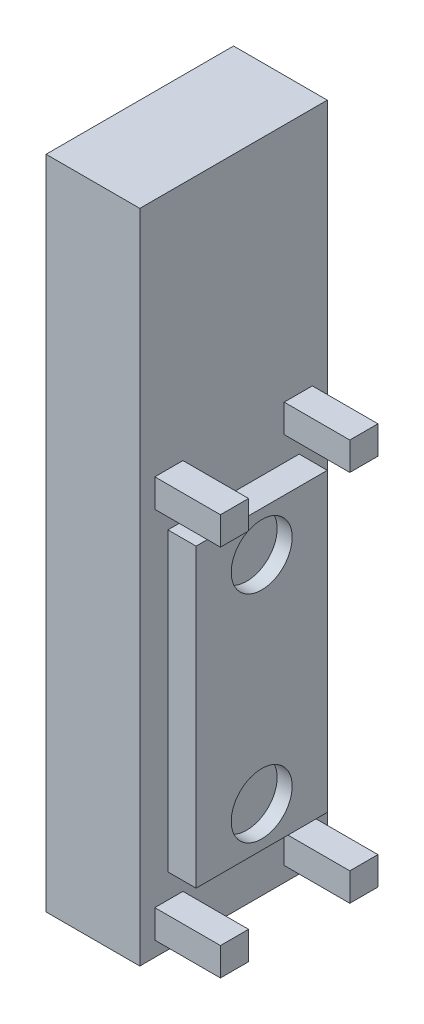
ISO-10303-21;
HEADER;
FILE_DESCRIPTION(('STEP AP214'),'2;1');
FILE_NAME('part.step','',(''),(''),'','','');
FILE_SCHEMA(('AUTOMOTIVE_DESIGN { 1 0 10303 214 1 1 1 1 }'));
ENDSEC;
DATA;
#1=APPLICATION_CONTEXT('core data for automotive mechanical design processes');
#2=APPLICATION_PROTOCOL_DEFINITION('international standard','automotive_design',2000,#1);
#3=PRODUCT_CONTEXT('',#1,'mechanical');
#4=PRODUCT('Part','Part','',(#3));
#5=PRODUCT_RELATED_PRODUCT_CATEGORY('part','',(#4));
#6=PRODUCT_DEFINITION_FORMATION('','',#4);
#7=PRODUCT_DEFINITION_CONTEXT('part definition',#1,'design');
#8=PRODUCT_DEFINITION('design','',#6,#7);
#9=PRODUCT_DEFINITION_SHAPE('','',#8);
#10=(LENGTH_UNIT() NAMED_UNIT(*) SI_UNIT(.MILLI.,.METRE.));
#11=(NAMED_UNIT(*) PLANE_ANGLE_UNIT() SI_UNIT($,.RADIAN.));
#12=(NAMED_UNIT(*) SI_UNIT($,.STERADIAN.) SOLID_ANGLE_UNIT());
#13=UNCERTAINTY_MEASURE_WITH_UNIT(LENGTH_MEASURE(1.E-05),#10,'distance_accuracy_value','');
#14=(GEOMETRIC_REPRESENTATION_CONTEXT(3) GLOBAL_UNCERTAINTY_ASSIGNED_CONTEXT((#13)) GLOBAL_UNIT_ASSIGNED_CONTEXT((#10,
#11,#12)) REPRESENTATION_CONTEXT('',''));
#15=CARTESIAN_POINT('',(0.,0.,0.));
#16=DIRECTION('',(0.,0.,1.));
#17=DIRECTION('',(1.,0.,0.));
#18=AXIS2_PLACEMENT_3D('',#15,#16,#17);
#19=CARTESIAN_POINT('',(10.,0.,0.));
#20=DIRECTION('',(-1.,0.,0.));
#21=DIRECTION('',(0.,0.,1.));
#22=AXIS2_PLACEMENT_3D('',#19,#20,#21);
#23=PLANE('',#22);
#24=DIRECTION('',(0.,-1.,0.));
#25=VECTOR('',#24,1.);
#26=CARTESIAN_POINT('',(10.,-30.4,8.4));
#27=LINE('',#26,#25);
#28=CARTESIAN_POINT('',(10.,-30.4,8.4));
#29=VERTEX_POINT('',#28);
#30=CARTESIAN_POINT('',(10.,-33.4,8.4));
#31=VERTEX_POINT('',#30);
#32=EDGE_CURVE('E293',#29,#31,#27,.T.);
#33=ORIENTED_EDGE('',*,*,#32,.F.);
#34=DIRECTION('',(0.,0.,1.));
#35=VECTOR('',#34,1.);
#36=CARTESIAN_POINT('',(10.,-30.4,8.4));
#37=LINE('',#36,#35);
#38=CARTESIAN_POINT('',(10.,-30.4,5.4));
#39=VERTEX_POINT('',#38);
#40=EDGE_CURVE('E345',#39,#29,#37,.T.);
#41=ORIENTED_EDGE('',*,*,#40,.F.);
#42=DIRECTION('',(0.,1.,0.));
#43=VECTOR('',#42,1.);
#44=CARTESIAN_POINT('',(10.,-30.4,5.4));
#45=LINE('',#44,#43);
#46=CARTESIAN_POINT('',(10.,-33.4,5.4));
#47=VERTEX_POINT('',#46);
#48=EDGE_CURVE('E349',#47,#39,#45,.T.);
#49=ORIENTED_EDGE('',*,*,#48,.F.);
#50=DIRECTION('',(0.,0.,-1.));
#51=VECTOR('',#50,1.);
#52=CARTESIAN_POINT('',(10.,-33.4,8.4));
#53=LINE('',#52,#51);
#54=EDGE_CURVE('E354',#31,#47,#53,.T.);
#55=ORIENTED_EDGE('',*,*,#54,.F.);
#56=EDGE_LOOP('',(#33,#41,#49,#55));
#57=FACE_BOUND('',#56,.T.);
#58=DIRECTION('',(0.,1.,0.));
#59=VECTOR('',#58,1.);
#60=CARTESIAN_POINT('',(10.,6.40000000000001,-8.40000000000001));
#61=LINE('',#60,#59);
#62=CARTESIAN_POINT('',(10.,6.40000000000001,-8.40000000000001));
#63=VERTEX_POINT('',#62);
#64=CARTESIAN_POINT('',(10.,9.40000000000001,-8.40000000000001));
#65=VERTEX_POINT('',#64);
#66=EDGE_CURVE('E272',#63,#65,#61,.T.);
#67=ORIENTED_EDGE('',*,*,#66,.F.);
#68=DIRECTION('',(0.,0.,-1.));
#69=VECTOR('',#68,1.);
#70=CARTESIAN_POINT('',(10.,6.40000000000001,-8.40000000000001));
#71=LINE('',#70,#69);
#72=CARTESIAN_POINT('',(10.,6.40000000000001,-5.40000000000001));
#73=VERTEX_POINT('',#72);
#74=EDGE_CURVE('E259',#73,#63,#71,.T.);
#75=ORIENTED_EDGE('',*,*,#74,.F.);
#76=DIRECTION('',(0.,-1.,0.));
#77=VECTOR('',#76,1.);
#78=CARTESIAN_POINT('',(10.,6.40000000000001,-5.40000000000001));
#79=LINE('',#78,#77);
#80=CARTESIAN_POINT('',(10.,9.40000000000001,-5.40000000000001));
#81=VERTEX_POINT('',#80);
#82=EDGE_CURVE('E263',#81,#73,#79,.T.);
#83=ORIENTED_EDGE('',*,*,#82,.F.);
#84=DIRECTION('',(0.,0.,1.));
#85=VECTOR('',#84,1.);
#86=CARTESIAN_POINT('',(10.,9.40000000000001,-8.40000000000001));
#87=LINE('',#86,#85);
#88=EDGE_CURVE('E268',#65,#81,#87,.T.);
#89=ORIENTED_EDGE('',*,*,#88,.F.);
#90=EDGE_LOOP('',(#67,#75,#83,#89));
#91=FACE_BOUND('',#90,.T.);
#92=DIRECTION('',(0.,1.,0.));
#93=VECTOR('',#92,1.);
#94=CARTESIAN_POINT('',(10.,-35.,-10.));
#95=LINE('',#94,#93);
#96=CARTESIAN_POINT('',(10.,-35.,-10.));
#97=VERTEX_POINT('',#96);
#98=CARTESIAN_POINT('',(10.,35.,-10.));
#99=VERTEX_POINT('',#98);
#100=EDGE_CURVE('E417',#97,#99,#95,.T.);
#101=ORIENTED_EDGE('',*,*,#100,.T.);
#102=DIRECTION('',(0.,0.,1.));
#103=VECTOR('',#102,1.);
#104=CARTESIAN_POINT('',(10.,35.,10.));
#105=LINE('',#104,#103);
#106=CARTESIAN_POINT('',(10.,35.,10.));
#107=VERTEX_POINT('',#106);
#108=EDGE_CURVE('E421',#99,#107,#105,.T.);
#109=ORIENTED_EDGE('',*,*,#108,.T.);
#110=DIRECTION('',(0.,-1.,0.));
#111=VECTOR('',#110,1.);
#112=CARTESIAN_POINT('',(10.,-35.,10.));
#113=LINE('',#112,#111);
#114=CARTESIAN_POINT('',(10.,-35.,10.));
#115=VERTEX_POINT('',#114);
#116=EDGE_CURVE('E425',#107,#115,#113,.T.);
#117=ORIENTED_EDGE('',*,*,#116,.T.);
#118=DIRECTION('',(0.,0.,-1.));
#119=VECTOR('',#118,1.);
#120=CARTESIAN_POINT('',(10.,-35.,10.));
#121=LINE('',#120,#119);
#122=EDGE_CURVE('E428',#115,#97,#121,.T.);
#123=ORIENTED_EDGE('',*,*,#122,.T.);
#124=EDGE_LOOP('',(#101,#109,#117,#123));
#125=FACE_BOUND('',#124,.T.);
#126=DIRECTION('',(0.,1.,0.));
#127=VECTOR('',#126,1.);
#128=CARTESIAN_POINT('',(10.,6.40000000000001,5.4));
#129=LINE('',#128,#127);
#130=CARTESIAN_POINT('',(10.,6.40000000000001,5.4));
#131=VERTEX_POINT('',#130);
#132=CARTESIAN_POINT('',(10.,9.40000000000001,5.4));
#133=VERTEX_POINT('',#132);
#134=EDGE_CURVE('E276',#131,#133,#129,.T.);
#135=ORIENTED_EDGE('',*,*,#134,.F.);
#136=DIRECTION('',(0.,0.,-1.));
#137=VECTOR('',#136,1.);
#138=CARTESIAN_POINT('',(10.,6.40000000000001,8.4));
#139=LINE('',#138,#137);
#140=CARTESIAN_POINT('',(10.,6.40000000000001,8.4));
#141=VERTEX_POINT('',#140);
#142=EDGE_CURVE('E377',#141,#131,#139,.T.);
#143=ORIENTED_EDGE('',*,*,#142,.F.);
#144=DIRECTION('',(0.,-1.,0.));
#145=VECTOR('',#144,1.);
#146=CARTESIAN_POINT('',(10.,6.40000000000001,8.4));
#147=LINE('',#146,#145);
#148=CARTESIAN_POINT('',(10.,9.40000000000001,8.4));
#149=VERTEX_POINT('',#148);
#150=EDGE_CURVE('E394',#149,#141,#147,.T.);
#151=ORIENTED_EDGE('',*,*,#150,.F.);
#152=DIRECTION('',(0.,0.,1.));
#153=VECTOR('',#152,1.);
#154=CARTESIAN_POINT('',(10.,9.40000000000001,8.4));
#155=LINE('',#154,#153);
#156=EDGE_CURVE('E390',#133,#149,#155,.T.);
#157=ORIENTED_EDGE('',*,*,#156,.F.);
#158=EDGE_LOOP('',(#135,#143,#151,#157));
#159=FACE_BOUND('',#158,.T.);
#160=DIRECTION('',(0.,1.,0.));
#161=VECTOR('',#160,1.);
#162=CARTESIAN_POINT('',(10.,-30.4,-8.40000000000001));
#163=LINE('',#162,#161);
#164=CARTESIAN_POINT('',(10.,-33.4,-8.40000000000001));
#165=VERTEX_POINT('',#164);
#166=CARTESIAN_POINT('',(10.,-30.4,-8.40000000000001));
#167=VERTEX_POINT('',#166);
#168=EDGE_CURVE('E246',#165,#167,#163,.T.);
#169=ORIENTED_EDGE('',*,*,#168,.F.);
#170=DIRECTION('',(0.,0.,-1.));
#171=VECTOR('',#170,1.);
#172=CARTESIAN_POINT('',(10.,-33.4,-8.40000000000001));
#173=LINE('',#172,#171);
#174=CARTESIAN_POINT('',(10.,-33.4,-5.4));
#175=VERTEX_POINT('',#174);
#176=EDGE_CURVE('E306',#175,#165,#173,.T.);
#177=ORIENTED_EDGE('',*,*,#176,.F.);
#178=DIRECTION('',(0.,-1.,0.));
#179=VECTOR('',#178,1.);
#180=CARTESIAN_POINT('',(10.,-30.4,-5.40000000000001));
#181=LINE('',#180,#179);
#182=CARTESIAN_POINT('',(10.,-30.4,-5.40000000000001));
#183=VERTEX_POINT('',#182);
#184=EDGE_CURVE('E310',#183,#175,#181,.T.);
#185=ORIENTED_EDGE('',*,*,#184,.F.);
#186=DIRECTION('',(0.,0.,1.));
#187=VECTOR('',#186,1.);
#188=CARTESIAN_POINT('',(10.,-30.4,-8.40000000000001));
#189=LINE('',#188,#187);
#190=EDGE_CURVE('E315',#167,#183,#189,.T.);
#191=ORIENTED_EDGE('',*,*,#190,.F.);
#192=EDGE_LOOP('',(#169,#177,#185,#191));
#193=FACE_BOUND('',#192,.T.);
#194=DIRECTION('',(0.,1.,0.));
#195=VECTOR('',#194,1.);
#196=CARTESIAN_POINT('',(10.,-27.8,-7.00000000000001));
#197=LINE('',#196,#195);
#198=CARTESIAN_POINT('',(10.,-27.8,-7.00000000000001));
#199=VERTEX_POINT('',#198);
#200=CARTESIAN_POINT('',(10.,3.80000000000001,-7.00000000000001));
#201=VERTEX_POINT('',#200);
#202=EDGE_CURVE('E228',#199,#201,#197,.T.);
#203=ORIENTED_EDGE('',*,*,#202,.F.);
#204=DIRECTION('',(0.,0.,-1.));
#205=VECTOR('',#204,1.);
#206=CARTESIAN_POINT('',(10.,-27.8,6.99999999999999));
#207=LINE('',#206,#205);
#208=CARTESIAN_POINT('',(10.,-27.8,6.99999999999999));
#209=VERTEX_POINT('',#208);
#210=EDGE_CURVE('E225',#209,#199,#207,.T.);
#211=ORIENTED_EDGE('',*,*,#210,.F.);
#212=DIRECTION('',(0.,-1.,0.));
#213=VECTOR('',#212,1.);
#214=CARTESIAN_POINT('',(10.,-27.8,6.99999999999999));
#215=LINE('',#214,#213);
#216=CARTESIAN_POINT('',(10.,3.80000000000001,6.99999999999999));
#217=VERTEX_POINT('',#216);
#218=EDGE_CURVE('E65',#217,#209,#215,.T.);
#219=ORIENTED_EDGE('',*,*,#218,.F.);
#220=DIRECTION('',(0.,0.,1.));
#221=VECTOR('',#220,1.);
#222=CARTESIAN_POINT('',(10.,3.80000000000001,6.99999999999999));
#223=LINE('',#222,#221);
#224=EDGE_CURVE('E60',#201,#217,#223,.T.);
#225=ORIENTED_EDGE('',*,*,#224,.F.);
#226=EDGE_LOOP('',(#203,#211,#219,#225));
#227=FACE_BOUND('',#226,.T.);
#228=ADVANCED_FACE('F44',(#57,#91,#125,#159,#193,#227),#23,.F.);
#229=CARTESIAN_POINT('',(10.,-35.,-10.));
#230=DIRECTION('',(0.,0.,1.));
#231=DIRECTION('',(1.,0.,0.));
#232=AXIS2_PLACEMENT_3D('',#229,#230,#231);
#233=PLANE('',#232);
#234=DIRECTION('',(0.,1.,0.));
#235=VECTOR('',#234,1.);
#236=CARTESIAN_POINT('',(0.,-35.,-10.));
#237=LINE('',#236,#235);
#238=CARTESIAN_POINT('',(0.,-35.,-10.));
#239=VERTEX_POINT('',#238);
#240=CARTESIAN_POINT('',(0.,35.,-10.));
#241=VERTEX_POINT('',#240);
#242=EDGE_CURVE('E416',#239,#241,#237,.T.);
#243=ORIENTED_EDGE('',*,*,#242,.T.);
#244=DIRECTION('',(-1.,0.,0.));
#245=VECTOR('',#244,1.);
#246=CARTESIAN_POINT('',(10.,35.,-10.));
#247=LINE('',#246,#245);
#248=EDGE_CURVE('E11',#99,#241,#247,.T.);
#249=ORIENTED_EDGE('',*,*,#248,.F.);
#250=ORIENTED_EDGE('',*,*,#100,.F.);
#251=DIRECTION('',(-1.,0.,0.));
#252=VECTOR('',#251,1.);
#253=CARTESIAN_POINT('',(10.,-35.,-10.));
#254=LINE('',#253,#252);
#255=EDGE_CURVE('E431',#97,#239,#254,.T.);
#256=ORIENTED_EDGE('',*,*,#255,.T.);
#257=EDGE_LOOP('',(#243,#249,#250,#256));
#258=FACE_BOUND('',#257,.T.);
#259=ADVANCED_FACE('F46',(#258),#233,.F.);
#260=CARTESIAN_POINT('',(10.,35.,10.));
#261=DIRECTION('',(0.,-1.,0.));
#262=DIRECTION('',(0.,0.,-1.));
#263=AXIS2_PLACEMENT_3D('',#260,#261,#262);
#264=PLANE('',#263);
#265=DIRECTION('',(0.,0.,1.));
#266=VECTOR('',#265,1.);
#267=CARTESIAN_POINT('',(0.,35.,10.));
#268=LINE('',#267,#266);
#269=CARTESIAN_POINT('',(0.,35.,10.));
#270=VERTEX_POINT('',#269);
#271=EDGE_CURVE('E435',#241,#270,#268,.T.);
#272=ORIENTED_EDGE('',*,*,#271,.T.);
#273=DIRECTION('',(-1.,0.,0.));
#274=VECTOR('',#273,1.);
#275=CARTESIAN_POINT('',(10.,35.,10.));
#276=LINE('',#275,#274);
#277=EDGE_CURVE('E53',#107,#270,#276,.T.);
#278=ORIENTED_EDGE('',*,*,#277,.F.);
#279=ORIENTED_EDGE('',*,*,#108,.F.);
#280=ORIENTED_EDGE('',*,*,#248,.T.);
#281=EDGE_LOOP('',(#272,#278,#279,#280));
#282=FACE_BOUND('',#281,.T.);
#283=ADVANCED_FACE('F471',(#282),#264,.F.);
#284=CARTESIAN_POINT('',(10.,-35.,10.));
#285=DIRECTION('',(0.,0.,-1.));
#286=DIRECTION('',(-1.,0.,0.));
#287=AXIS2_PLACEMENT_3D('',#284,#285,#286);
#288=PLANE('',#287);
#289=DIRECTION('',(0.,-1.,0.));
#290=VECTOR('',#289,1.);
#291=CARTESIAN_POINT('',(0.,-35.,10.));
#292=LINE('',#291,#290);
#293=CARTESIAN_POINT('',(0.,-35.,10.));
#294=VERTEX_POINT('',#293);
#295=EDGE_CURVE('E438',#270,#294,#292,.T.);
#296=ORIENTED_EDGE('',*,*,#295,.T.);
#297=DIRECTION('',(-1.,0.,0.));
#298=VECTOR('',#297,1.);
#299=CARTESIAN_POINT('',(10.,-35.,10.));
#300=LINE('',#299,#298);
#301=EDGE_CURVE('E446',#115,#294,#300,.T.);
#302=ORIENTED_EDGE('',*,*,#301,.F.);
#303=ORIENTED_EDGE('',*,*,#116,.F.);
#304=ORIENTED_EDGE('',*,*,#277,.T.);
#305=EDGE_LOOP('',(#296,#302,#303,#304));
#306=FACE_BOUND('',#305,.T.);
#307=ADVANCED_FACE('F455',(#306),#288,.F.);
#308=CARTESIAN_POINT('',(10.,-35.,10.));
#309=DIRECTION('',(0.,1.,0.));
#310=DIRECTION('',(0.,0.,1.));
#311=AXIS2_PLACEMENT_3D('',#308,#309,#310);
#312=PLANE('',#311);
#313=DIRECTION('',(0.,0.,-1.));
#314=VECTOR('',#313,1.);
#315=CARTESIAN_POINT('',(0.,-35.,10.));
#316=LINE('',#315,#314);
#317=EDGE_CURVE('E422',#294,#239,#316,.T.);
#318=ORIENTED_EDGE('',*,*,#317,.T.);
#319=ORIENTED_EDGE('',*,*,#255,.F.);
#320=ORIENTED_EDGE('',*,*,#122,.F.);
#321=ORIENTED_EDGE('',*,*,#301,.T.);
#322=EDGE_LOOP('',(#318,#319,#320,#321));
#323=FACE_BOUND('',#322,.T.);
#324=ADVANCED_FACE('F464',(#323),#312,.F.);
#325=CARTESIAN_POINT('',(0.,0.,0.));
#326=DIRECTION('',(-1.,0.,0.));
#327=DIRECTION('',(0.,0.,1.));
#328=AXIS2_PLACEMENT_3D('',#325,#326,#327);
#329=PLANE('',#328);
#330=ORIENTED_EDGE('',*,*,#242,.F.);
#331=ORIENTED_EDGE('',*,*,#317,.F.);
#332=ORIENTED_EDGE('',*,*,#295,.F.);
#333=ORIENTED_EDGE('',*,*,#271,.F.);
#334=EDGE_LOOP('',(#330,#331,#332,#333));
#335=FACE_BOUND('',#334,.T.);
#336=ADVANCED_FACE('F461',(#335),#329,.T.);
#337=CARTESIAN_POINT('',(17.,6.40000000000001,5.4));
#338=DIRECTION('',(0.,0.,1.));
#339=DIRECTION('',(1.,0.,0.));
#340=AXIS2_PLACEMENT_3D('',#337,#338,#339);
#341=PLANE('',#340);
#342=ORIENTED_EDGE('',*,*,#134,.T.);
#343=DIRECTION('',(-1.,0.,0.));
#344=VECTOR('',#343,1.);
#345=CARTESIAN_POINT('',(17.,9.40000000000001,5.4));
#346=LINE('',#345,#344);
#347=CARTESIAN_POINT('',(17.,9.40000000000001,5.4));
#348=VERTEX_POINT('',#347);
#349=EDGE_CURVE('E412',#348,#133,#346,.T.);
#350=ORIENTED_EDGE('',*,*,#349,.F.);
#351=DIRECTION('',(0.,1.,0.));
#352=VECTOR('',#351,1.);
#353=CARTESIAN_POINT('',(17.,6.40000000000001,5.4));
#354=LINE('',#353,#352);
#355=CARTESIAN_POINT('',(17.,6.40000000000001,5.4));
#356=VERTEX_POINT('',#355);
#357=EDGE_CURVE('E372',#356,#348,#354,.T.);
#358=ORIENTED_EDGE('',*,*,#357,.F.);
#359=DIRECTION('',(-1.,0.,0.));
#360=VECTOR('',#359,1.);
#361=CARTESIAN_POINT('',(17.,6.40000000000001,5.4));
#362=LINE('',#361,#360);
#363=EDGE_CURVE('E386',#356,#131,#362,.T.);
#364=ORIENTED_EDGE('',*,*,#363,.T.);
#365=EDGE_LOOP('',(#342,#350,#358,#364));
#366=FACE_BOUND('',#365,.T.);
#367=ADVANCED_FACE('F488',(#366),#341,.F.);
#368=CARTESIAN_POINT('',(17.,9.40000000000001,8.4));
#369=DIRECTION('',(0.,-1.,0.));
#370=DIRECTION('',(0.,0.,-1.));
#371=AXIS2_PLACEMENT_3D('',#368,#369,#370);
#372=PLANE('',#371);
#373=ORIENTED_EDGE('',*,*,#156,.T.);
#374=DIRECTION('',(-1.,0.,0.));
#375=VECTOR('',#374,1.);
#376=CARTESIAN_POINT('',(17.,9.40000000000001,8.4));
#377=LINE('',#376,#375);
#378=CARTESIAN_POINT('',(17.,9.40000000000001,8.4));
#379=VERTEX_POINT('',#378);
#380=EDGE_CURVE('E408',#379,#149,#377,.T.);
#381=ORIENTED_EDGE('',*,*,#380,.F.);
#382=DIRECTION('',(0.,0.,1.));
#383=VECTOR('',#382,1.);
#384=CARTESIAN_POINT('',(17.,9.40000000000001,8.4));
#385=LINE('',#384,#383);
#386=EDGE_CURVE('E376',#348,#379,#385,.T.);
#387=ORIENTED_EDGE('',*,*,#386,.F.);
#388=ORIENTED_EDGE('',*,*,#349,.T.);
#389=EDGE_LOOP('',(#373,#381,#387,#388));
#390=FACE_BOUND('',#389,.T.);
#391=ADVANCED_FACE('F509',(#390),#372,.F.);
#392=CARTESIAN_POINT('',(17.,6.40000000000001,8.4));
#393=DIRECTION('',(0.,0.,-1.));
#394=DIRECTION('',(-1.,0.,0.));
#395=AXIS2_PLACEMENT_3D('',#392,#393,#394);
#396=PLANE('',#395);
#397=ORIENTED_EDGE('',*,*,#150,.T.);
#398=DIRECTION('',(-1.,0.,0.));
#399=VECTOR('',#398,1.);
#400=CARTESIAN_POINT('',(17.,6.40000000000001,8.4));
#401=LINE('',#400,#399);
#402=CARTESIAN_POINT('',(17.,6.40000000000001,8.4));
#403=VERTEX_POINT('',#402);
#404=EDGE_CURVE('E404',#403,#141,#401,.T.);
#405=ORIENTED_EDGE('',*,*,#404,.F.);
#406=DIRECTION('',(0.,-1.,0.));
#407=VECTOR('',#406,1.);
#408=CARTESIAN_POINT('',(17.,6.40000000000001,8.4));
#409=LINE('',#408,#407);
#410=EDGE_CURVE('E380',#379,#403,#409,.T.);
#411=ORIENTED_EDGE('',*,*,#410,.F.);
#412=ORIENTED_EDGE('',*,*,#380,.T.);
#413=EDGE_LOOP('',(#397,#405,#411,#412));
#414=FACE_BOUND('',#413,.T.);
#415=ADVANCED_FACE('F517',(#414),#396,.F.);
#416=CARTESIAN_POINT('',(17.,6.40000000000001,8.4));
#417=DIRECTION('',(0.,1.,0.));
#418=DIRECTION('',(0.,0.,1.));
#419=AXIS2_PLACEMENT_3D('',#416,#417,#418);
#420=PLANE('',#419);
#421=ORIENTED_EDGE('',*,*,#142,.T.);
#422=ORIENTED_EDGE('',*,*,#363,.F.);
#423=DIRECTION('',(0.,0.,-1.));
#424=VECTOR('',#423,1.);
#425=CARTESIAN_POINT('',(17.,6.40000000000001,8.4));
#426=LINE('',#425,#424);
#427=EDGE_CURVE('E383',#403,#356,#426,.T.);
#428=ORIENTED_EDGE('',*,*,#427,.F.);
#429=ORIENTED_EDGE('',*,*,#404,.T.);
#430=EDGE_LOOP('',(#421,#422,#428,#429));
#431=FACE_BOUND('',#430,.T.);
#432=ADVANCED_FACE('F525',(#431),#420,.F.);
#433=CARTESIAN_POINT('',(17.,0.,0.));
#434=DIRECTION('',(-1.,0.,0.));
#435=DIRECTION('',(0.,0.,1.));
#436=AXIS2_PLACEMENT_3D('',#433,#434,#435);
#437=PLANE('',#436);
#438=ORIENTED_EDGE('',*,*,#357,.T.);
#439=ORIENTED_EDGE('',*,*,#386,.T.);
#440=ORIENTED_EDGE('',*,*,#410,.T.);
#441=ORIENTED_EDGE('',*,*,#427,.T.);
#442=EDGE_LOOP('',(#438,#439,#440,#441));
#443=FACE_BOUND('',#442,.T.);
#444=ADVANCED_FACE('F534',(#443),#437,.F.);
#445=CARTESIAN_POINT('',(17.,6.40000000000001,-8.40000000000001));
#446=DIRECTION('',(0.,0.,1.));
#447=DIRECTION('',(1.,0.,0.));
#448=AXIS2_PLACEMENT_3D('',#445,#446,#447);
#449=PLANE('',#448);
#450=ORIENTED_EDGE('',*,*,#66,.T.);
#451=DIRECTION('',(-1.,0.,0.));
#452=VECTOR('',#451,1.);
#453=CARTESIAN_POINT('',(17.,9.40000000000001,-8.40000000000001));
#454=LINE('',#453,#452);
#455=CARTESIAN_POINT('',(17.,9.40000000000001,-8.40000000000001));
#456=VERTEX_POINT('',#455);
#457=EDGE_CURVE('E241',#456,#65,#454,.T.);
#458=ORIENTED_EDGE('',*,*,#457,.F.);
#459=DIRECTION('',(0.,1.,0.));
#460=VECTOR('',#459,1.);
#461=CARTESIAN_POINT('',(17.,6.40000000000001,-8.40000000000001));
#462=LINE('',#461,#460);
#463=CARTESIAN_POINT('',(17.,6.40000000000001,-8.40000000000001));
#464=VERTEX_POINT('',#463);
#465=EDGE_CURVE('E264',#464,#456,#462,.T.);
#466=ORIENTED_EDGE('',*,*,#465,.F.);
#467=DIRECTION('',(-1.,0.,0.));
#468=VECTOR('',#467,1.);
#469=CARTESIAN_POINT('',(17.,6.40000000000001,-8.40000000000001));
#470=LINE('',#469,#468);
#471=EDGE_CURVE('E254',#464,#63,#470,.T.);
#472=ORIENTED_EDGE('',*,*,#471,.T.);
#473=EDGE_LOOP('',(#450,#458,#466,#472));
#474=FACE_BOUND('',#473,.T.);
#475=ADVANCED_FACE('F543',(#474),#449,.F.);
#476=CARTESIAN_POINT('',(17.,9.40000000000001,-8.40000000000001));
#477=DIRECTION('',(0.,-1.,0.));
#478=DIRECTION('',(0.,0.,-1.));
#479=AXIS2_PLACEMENT_3D('',#476,#477,#478);
#480=PLANE('',#479);
#481=ORIENTED_EDGE('',*,*,#88,.T.);
#482=DIRECTION('',(-1.,0.,0.));
#483=VECTOR('',#482,1.);
#484=CARTESIAN_POINT('',(17.,9.40000000000001,-5.40000000000001));
#485=LINE('',#484,#483);
#486=CARTESIAN_POINT('',(17.,9.40000000000001,-5.40000000000001));
#487=VERTEX_POINT('',#486);
#488=EDGE_CURVE('E245',#487,#81,#485,.T.);
#489=ORIENTED_EDGE('',*,*,#488,.F.);
#490=DIRECTION('',(0.,0.,1.));
#491=VECTOR('',#490,1.);
#492=CARTESIAN_POINT('',(17.,9.40000000000001,-8.40000000000001));
#493=LINE('',#492,#491);
#494=EDGE_CURVE('E282',#456,#487,#493,.T.);
#495=ORIENTED_EDGE('',*,*,#494,.F.);
#496=ORIENTED_EDGE('',*,*,#457,.T.);
#497=EDGE_LOOP('',(#481,#489,#495,#496));
#498=FACE_BOUND('',#497,.T.);
#499=ADVANCED_FACE('F552',(#498),#480,.F.);
#500=CARTESIAN_POINT('',(17.,6.40000000000001,-5.40000000000001));
#501=DIRECTION('',(0.,0.,-1.));
#502=DIRECTION('',(-1.,0.,0.));
#503=AXIS2_PLACEMENT_3D('',#500,#501,#502);
#504=PLANE('',#503);
#505=ORIENTED_EDGE('',*,*,#82,.T.);
#506=DIRECTION('',(-1.,0.,0.));
#507=VECTOR('',#506,1.);
#508=CARTESIAN_POINT('',(17.,6.40000000000001,-5.40000000000001));
#509=LINE('',#508,#507);
#510=CARTESIAN_POINT('',(17.,6.40000000000001,-5.40000000000001));
#511=VERTEX_POINT('',#510);
#512=EDGE_CURVE('E250',#511,#73,#509,.T.);
#513=ORIENTED_EDGE('',*,*,#512,.F.);
#514=DIRECTION('',(0.,-1.,0.));
#515=VECTOR('',#514,1.);
#516=CARTESIAN_POINT('',(17.,6.40000000000001,-5.40000000000001));
#517=LINE('',#516,#515);
#518=EDGE_CURVE('E279',#487,#511,#517,.T.);
#519=ORIENTED_EDGE('',*,*,#518,.F.);
#520=ORIENTED_EDGE('',*,*,#488,.T.);
#521=EDGE_LOOP('',(#505,#513,#519,#520));
#522=FACE_BOUND('',#521,.T.);
#523=ADVANCED_FACE('F561',(#522),#504,.F.);
#524=CARTESIAN_POINT('',(17.,6.40000000000001,-8.40000000000001));
#525=DIRECTION('',(0.,1.,0.));
#526=DIRECTION('',(0.,0.,1.));
#527=AXIS2_PLACEMENT_3D('',#524,#525,#526);
#528=PLANE('',#527);
#529=ORIENTED_EDGE('',*,*,#74,.T.);
#530=ORIENTED_EDGE('',*,*,#471,.F.);
#531=DIRECTION('',(0.,0.,-1.));
#532=VECTOR('',#531,1.);
#533=CARTESIAN_POINT('',(17.,6.40000000000001,-8.40000000000001));
#534=LINE('',#533,#532);
#535=EDGE_CURVE('E258',#511,#464,#534,.T.);
#536=ORIENTED_EDGE('',*,*,#535,.F.);
#537=ORIENTED_EDGE('',*,*,#512,.T.);
#538=EDGE_LOOP('',(#529,#530,#536,#537));
#539=FACE_BOUND('',#538,.T.);
#540=ADVANCED_FACE('F570',(#539),#528,.F.);
#541=CARTESIAN_POINT('',(17.,0.,0.));
#542=DIRECTION('',(1.,0.,0.));
#543=DIRECTION('',(0.,0.,-1.));
#544=AXIS2_PLACEMENT_3D('',#541,#542,#543);
#545=PLANE('',#544);
#546=ORIENTED_EDGE('',*,*,#465,.T.);
#547=ORIENTED_EDGE('',*,*,#494,.T.);
#548=ORIENTED_EDGE('',*,*,#518,.T.);
#549=ORIENTED_EDGE('',*,*,#535,.T.);
#550=EDGE_LOOP('',(#546,#547,#548,#549));
#551=FACE_BOUND('',#550,.T.);
#552=ADVANCED_FACE('F579',(#551),#545,.T.);
#553=CARTESIAN_POINT('',(17.,-30.4,-8.40000000000001));
#554=DIRECTION('',(0.,0.,1.));
#555=DIRECTION('',(1.,0.,0.));
#556=AXIS2_PLACEMENT_3D('',#553,#554,#555);
#557=PLANE('',#556);
#558=ORIENTED_EDGE('',*,*,#168,.T.);
#559=DIRECTION('',(-1.,0.,0.));
#560=VECTOR('',#559,1.);
#561=CARTESIAN_POINT('',(17.,-30.4,-8.40000000000001));
#562=LINE('',#561,#560);
#563=CARTESIAN_POINT('',(17.,-30.4,-8.40000000000001));
#564=VERTEX_POINT('',#563);
#565=EDGE_CURVE('E288',#564,#167,#562,.T.);
#566=ORIENTED_EDGE('',*,*,#565,.F.);
#567=DIRECTION('',(0.,1.,0.));
#568=VECTOR('',#567,1.);
#569=CARTESIAN_POINT('',(17.,-30.4,-8.40000000000001));
#570=LINE('',#569,#568);
#571=CARTESIAN_POINT('',(17.,-33.4,-8.40000000000001));
#572=VERTEX_POINT('',#571);
#573=EDGE_CURVE('E311',#572,#564,#570,.T.);
#574=ORIENTED_EDGE('',*,*,#573,.F.);
#575=DIRECTION('',(-1.,0.,0.));
#576=VECTOR('',#575,1.);
#577=CARTESIAN_POINT('',(17.,-33.4,-8.40000000000001));
#578=LINE('',#577,#576);
#579=EDGE_CURVE('E301',#572,#165,#578,.T.);
#580=ORIENTED_EDGE('',*,*,#579,.T.);
#581=EDGE_LOOP('',(#558,#566,#574,#580));
#582=FACE_BOUND('',#581,.T.);
#583=ADVANCED_FACE('F588',(#582),#557,.F.);
#584=CARTESIAN_POINT('',(17.,-30.4,-8.40000000000001));
#585=DIRECTION('',(0.,-1.,0.));
#586=DIRECTION('',(0.,0.,-1.));
#587=AXIS2_PLACEMENT_3D('',#584,#585,#586);
#588=PLANE('',#587);
#589=ORIENTED_EDGE('',*,*,#190,.T.);
#590=DIRECTION('',(-1.,0.,0.));
#591=VECTOR('',#590,1.);
#592=CARTESIAN_POINT('',(17.,-30.4,-5.40000000000001));
#593=LINE('',#592,#591);
#594=CARTESIAN_POINT('',(17.,-30.4,-5.40000000000001));
#595=VERTEX_POINT('',#594);
#596=EDGE_CURVE('E292',#595,#183,#593,.T.);
#597=ORIENTED_EDGE('',*,*,#596,.F.);
#598=DIRECTION('',(0.,0.,1.));
#599=VECTOR('',#598,1.);
#600=CARTESIAN_POINT('',(17.,-30.4,-8.40000000000001));
#601=LINE('',#600,#599);
#602=EDGE_CURVE('E327',#564,#595,#601,.T.);
#603=ORIENTED_EDGE('',*,*,#602,.F.);
#604=ORIENTED_EDGE('',*,*,#565,.T.);
#605=EDGE_LOOP('',(#589,#597,#603,#604));
#606=FACE_BOUND('',#605,.T.);
#607=ADVANCED_FACE('F597',(#606),#588,.F.);
#608=CARTESIAN_POINT('',(17.,-30.4,-5.40000000000001));
#609=DIRECTION('',(0.,0.,-1.));
#610=DIRECTION('',(0.,1.,0.));
#611=AXIS2_PLACEMENT_3D('',#608,#609,#610);
#612=PLANE('',#611);
#613=ORIENTED_EDGE('',*,*,#184,.T.);
#614=DIRECTION('',(-1.,0.,0.));
#615=VECTOR('',#614,1.);
#616=CARTESIAN_POINT('',(17.,-33.4,-5.4));
#617=LINE('',#616,#615);
#618=CARTESIAN_POINT('',(17.,-33.4,-5.4));
#619=VERTEX_POINT('',#618);
#620=EDGE_CURVE('E297',#619,#175,#617,.T.);
#621=ORIENTED_EDGE('',*,*,#620,.F.);
#622=DIRECTION('',(0.,-1.,0.));
#623=VECTOR('',#622,1.);
#624=CARTESIAN_POINT('',(17.,-30.4,-5.40000000000001));
#625=LINE('',#624,#623);
#626=EDGE_CURVE('E324',#595,#619,#625,.T.);
#627=ORIENTED_EDGE('',*,*,#626,.F.);
#628=ORIENTED_EDGE('',*,*,#596,.T.);
#629=EDGE_LOOP('',(#613,#621,#627,#628));
#630=FACE_BOUND('',#629,.T.);
#631=ADVANCED_FACE('F606',(#630),#612,.F.);
#632=CARTESIAN_POINT('',(17.,-33.4,-8.40000000000001));
#633=DIRECTION('',(0.,1.,0.));
#634=DIRECTION('',(0.,0.,1.));
#635=AXIS2_PLACEMENT_3D('',#632,#633,#634);
#636=PLANE('',#635);
#637=ORIENTED_EDGE('',*,*,#176,.T.);
#638=ORIENTED_EDGE('',*,*,#579,.F.);
#639=DIRECTION('',(0.,0.,-1.));
#640=VECTOR('',#639,1.);
#641=CARTESIAN_POINT('',(17.,-33.4,-8.40000000000001));
#642=LINE('',#641,#640);
#643=EDGE_CURVE('E305',#619,#572,#642,.T.);
#644=ORIENTED_EDGE('',*,*,#643,.F.);
#645=ORIENTED_EDGE('',*,*,#620,.T.);
#646=EDGE_LOOP('',(#637,#638,#644,#645));
#647=FACE_BOUND('',#646,.T.);
#648=ADVANCED_FACE('F615',(#647),#636,.F.);
#649=CARTESIAN_POINT('',(17.,0.,0.));
#650=DIRECTION('',(-1.,0.,0.));
#651=DIRECTION('',(0.,0.,1.));
#652=AXIS2_PLACEMENT_3D('',#649,#650,#651);
#653=PLANE('',#652);
#654=ORIENTED_EDGE('',*,*,#573,.T.);
#655=ORIENTED_EDGE('',*,*,#602,.T.);
#656=ORIENTED_EDGE('',*,*,#626,.T.);
#657=ORIENTED_EDGE('',*,*,#643,.T.);
#658=EDGE_LOOP('',(#654,#655,#656,#657));
#659=FACE_BOUND('',#658,.T.);
#660=ADVANCED_FACE('F624',(#659),#653,.F.);
#661=CARTESIAN_POINT('',(17.,-30.4,8.4));
#662=DIRECTION('',(0.,0.,-1.));
#663=DIRECTION('',(-1.,0.,0.));
#664=AXIS2_PLACEMENT_3D('',#661,#662,#663);
#665=PLANE('',#664);
#666=ORIENTED_EDGE('',*,*,#32,.T.);
#667=DIRECTION('',(-1.,0.,0.));
#668=VECTOR('',#667,1.);
#669=CARTESIAN_POINT('',(17.,-33.4,8.4));
#670=LINE('',#669,#668);
#671=CARTESIAN_POINT('',(17.,-33.4,8.4));
#672=VERTEX_POINT('',#671);
#673=EDGE_CURVE('E230',#672,#31,#670,.T.);
#674=ORIENTED_EDGE('',*,*,#673,.F.);
#675=DIRECTION('',(0.,-1.,0.));
#676=VECTOR('',#675,1.);
#677=CARTESIAN_POINT('',(17.,-30.4,8.4));
#678=LINE('',#677,#676);
#679=CARTESIAN_POINT('',(17.,-30.4,8.4));
#680=VERTEX_POINT('',#679);
#681=EDGE_CURVE('E350',#680,#672,#678,.T.);
#682=ORIENTED_EDGE('',*,*,#681,.F.);
#683=DIRECTION('',(-1.,0.,0.));
#684=VECTOR('',#683,1.);
#685=CARTESIAN_POINT('',(17.,-30.4,8.4));
#686=LINE('',#685,#684);
#687=EDGE_CURVE('E340',#680,#29,#686,.T.);
#688=ORIENTED_EDGE('',*,*,#687,.T.);
#689=EDGE_LOOP('',(#666,#674,#682,#688));
#690=FACE_BOUND('',#689,.T.);
#691=ADVANCED_FACE('F633',(#690),#665,.F.);
#692=CARTESIAN_POINT('',(17.,-33.4,8.4));
#693=DIRECTION('',(0.,1.,0.));
#694=DIRECTION('',(0.,0.,1.));
#695=AXIS2_PLACEMENT_3D('',#692,#693,#694);
#696=PLANE('',#695);
#697=ORIENTED_EDGE('',*,*,#54,.T.);
#698=DIRECTION('',(-1.,0.,0.));
#699=VECTOR('',#698,1.);
#700=CARTESIAN_POINT('',(17.,-33.4,5.4));
#701=LINE('',#700,#699);
#702=CARTESIAN_POINT('',(17.,-33.4,5.4));
#703=VERTEX_POINT('',#702);
#704=EDGE_CURVE('E235',#703,#47,#701,.T.);
#705=ORIENTED_EDGE('',*,*,#704,.F.);
#706=DIRECTION('',(0.,0.,-1.));
#707=VECTOR('',#706,1.);
#708=CARTESIAN_POINT('',(17.,-33.4,8.4));
#709=LINE('',#708,#707);
#710=EDGE_CURVE('E366',#672,#703,#709,.T.);
#711=ORIENTED_EDGE('',*,*,#710,.F.);
#712=ORIENTED_EDGE('',*,*,#673,.T.);
#713=EDGE_LOOP('',(#697,#705,#711,#712));
#714=FACE_BOUND('',#713,.T.);
#715=ADVANCED_FACE('F642',(#714),#696,.F.);
#716=CARTESIAN_POINT('',(17.,-30.4,5.4));
#717=DIRECTION('',(0.,0.,1.));
#718=DIRECTION('',(1.,0.,0.));
#719=AXIS2_PLACEMENT_3D('',#716,#717,#718);
#720=PLANE('',#719);
#721=ORIENTED_EDGE('',*,*,#48,.T.);
#722=DIRECTION('',(-1.,0.,0.));
#723=VECTOR('',#722,1.);
#724=CARTESIAN_POINT('',(17.,-30.4,5.4));
#725=LINE('',#724,#723);
#726=CARTESIAN_POINT('',(17.,-30.4,5.4));
#727=VERTEX_POINT('',#726);
#728=EDGE_CURVE('E336',#727,#39,#725,.T.);
#729=ORIENTED_EDGE('',*,*,#728,.F.);
#730=DIRECTION('',(0.,1.,0.));
#731=VECTOR('',#730,1.);
#732=CARTESIAN_POINT('',(17.,-30.4,5.4));
#733=LINE('',#732,#731);
#734=EDGE_CURVE('E363',#703,#727,#733,.T.);
#735=ORIENTED_EDGE('',*,*,#734,.F.);
#736=ORIENTED_EDGE('',*,*,#704,.T.);
#737=EDGE_LOOP('',(#721,#729,#735,#736));
#738=FACE_BOUND('',#737,.T.);
#739=ADVANCED_FACE('F651',(#738),#720,.F.);
#740=CARTESIAN_POINT('',(17.,-30.4,8.4));
#741=DIRECTION('',(0.,-1.,0.));
#742=DIRECTION('',(0.,0.,-1.));
#743=AXIS2_PLACEMENT_3D('',#740,#741,#742);
#744=PLANE('',#743);
#745=ORIENTED_EDGE('',*,*,#40,.T.);
#746=ORIENTED_EDGE('',*,*,#687,.F.);
#747=DIRECTION('',(0.,0.,1.));
#748=VECTOR('',#747,1.);
#749=CARTESIAN_POINT('',(17.,-30.4,8.4));
#750=LINE('',#749,#748);
#751=EDGE_CURVE('E344',#727,#680,#750,.T.);
#752=ORIENTED_EDGE('',*,*,#751,.F.);
#753=ORIENTED_EDGE('',*,*,#728,.T.);
#754=EDGE_LOOP('',(#745,#746,#752,#753));
#755=FACE_BOUND('',#754,.T.);
#756=ADVANCED_FACE('F660',(#755),#744,.F.);
#757=CARTESIAN_POINT('',(17.,0.,0.));
#758=DIRECTION('',(1.,0.,0.));
#759=DIRECTION('',(0.,0.,-1.));
#760=AXIS2_PLACEMENT_3D('',#757,#758,#759);
#761=PLANE('',#760);
#762=ORIENTED_EDGE('',*,*,#681,.T.);
#763=ORIENTED_EDGE('',*,*,#710,.T.);
#764=ORIENTED_EDGE('',*,*,#734,.T.);
#765=ORIENTED_EDGE('',*,*,#751,.T.);
#766=EDGE_LOOP('',(#762,#763,#764,#765));
#767=FACE_BOUND('',#766,.T.);
#768=ADVANCED_FACE('F668',(#767),#761,.T.);
#769=CARTESIAN_POINT('',(13.,-27.8,-7.00000000000001));
#770=DIRECTION('',(0.,0.,1.));
#771=DIRECTION('',(1.,0.,0.));
#772=AXIS2_PLACEMENT_3D('',#769,#770,#771);
#773=PLANE('',#772);
#774=ORIENTED_EDGE('',*,*,#202,.T.);
#775=DIRECTION('',(-1.,0.,0.));
#776=VECTOR('',#775,1.);
#777=CARTESIAN_POINT('',(13.,3.80000000000001,-7.00000000000001));
#778=LINE('',#777,#776);
#779=CARTESIAN_POINT('',(13.,3.80000000000001,-7.00000000000001));
#780=VERTEX_POINT('',#779);
#781=EDGE_CURVE('E207',#780,#201,#778,.T.);
#782=ORIENTED_EDGE('',*,*,#781,.F.);
#783=DIRECTION('',(0.,1.,0.));
#784=VECTOR('',#783,1.);
#785=CARTESIAN_POINT('',(13.,-27.8,-7.00000000000001));
#786=LINE('',#785,#784);
#787=CARTESIAN_POINT('',(13.,-27.8,-7.00000000000001));
#788=VERTEX_POINT('',#787);
#789=EDGE_CURVE('E215',#788,#780,#786,.T.);
#790=ORIENTED_EDGE('',*,*,#789,.F.);
#791=DIRECTION('',(-1.,0.,0.));
#792=VECTOR('',#791,1.);
#793=CARTESIAN_POINT('',(13.,-27.8,-7.00000000000001));
#794=LINE('',#793,#792);
#795=EDGE_CURVE('E793',#788,#199,#794,.T.);
#796=ORIENTED_EDGE('',*,*,#795,.T.);
#797=EDGE_LOOP('',(#774,#782,#790,#796));
#798=FACE_BOUND('',#797,.T.);
#799=ADVANCED_FACE('F227',(#798),#773,.F.);
#800=CARTESIAN_POINT('',(13.,3.80000000000001,6.99999999999999));
#801=DIRECTION('',(0.,-1.,0.));
#802=DIRECTION('',(0.,0.,-1.));
#803=AXIS2_PLACEMENT_3D('',#800,#801,#802);
#804=PLANE('',#803);
#805=ORIENTED_EDGE('',*,*,#224,.T.);
#806=DIRECTION('',(-1.,0.,0.));
#807=VECTOR('',#806,1.);
#808=CARTESIAN_POINT('',(13.,3.80000000000001,6.99999999999999));
#809=LINE('',#808,#807);
#810=CARTESIAN_POINT('',(13.,3.80000000000001,6.99999999999999));
#811=VERTEX_POINT('',#810);
#812=EDGE_CURVE('E210',#811,#217,#809,.T.);
#813=ORIENTED_EDGE('',*,*,#812,.F.);
#814=DIRECTION('',(0.,0.,1.));
#815=VECTOR('',#814,1.);
#816=CARTESIAN_POINT('',(13.,3.80000000000001,6.99999999999999));
#817=LINE('',#816,#815);
#818=EDGE_CURVE('E203',#780,#811,#817,.T.);
#819=ORIENTED_EDGE('',*,*,#818,.F.);
#820=ORIENTED_EDGE('',*,*,#781,.T.);
#821=EDGE_LOOP('',(#805,#813,#819,#820));
#822=FACE_BOUND('',#821,.T.);
#823=ADVANCED_FACE('F205',(#822),#804,.F.);
#824=CARTESIAN_POINT('',(13.,-27.8,6.99999999999999));
#825=DIRECTION('',(0.,0.,-1.));
#826=DIRECTION('',(-1.,0.,0.));
#827=AXIS2_PLACEMENT_3D('',#824,#825,#826);
#828=PLANE('',#827);
#829=ORIENTED_EDGE('',*,*,#218,.T.);
#830=DIRECTION('',(-1.,0.,0.));
#831=VECTOR('',#830,1.);
#832=CARTESIAN_POINT('',(13.,-27.8,6.99999999999999));
#833=LINE('',#832,#831);
#834=CARTESIAN_POINT('',(13.,-27.8,6.99999999999999));
#835=VERTEX_POINT('',#834);
#836=EDGE_CURVE('E237',#835,#209,#833,.T.);
#837=ORIENTED_EDGE('',*,*,#836,.F.);
#838=DIRECTION('',(0.,-1.,0.));
#839=VECTOR('',#838,1.);
#840=CARTESIAN_POINT('',(13.,-27.8,6.99999999999999));
#841=LINE('',#840,#839);
#842=EDGE_CURVE('E214',#811,#835,#841,.T.);
#843=ORIENTED_EDGE('',*,*,#842,.F.);
#844=ORIENTED_EDGE('',*,*,#812,.T.);
#845=EDGE_LOOP('',(#829,#837,#843,#844));
#846=FACE_BOUND('',#845,.T.);
#847=ADVANCED_FACE('F699',(#846),#828,.F.);
#848=CARTESIAN_POINT('',(13.,-27.8,6.99999999999999));
#849=DIRECTION('',(0.,1.,0.));
#850=DIRECTION('',(0.,0.,1.));
#851=AXIS2_PLACEMENT_3D('',#848,#849,#850);
#852=PLANE('',#851);
#853=ORIENTED_EDGE('',*,*,#210,.T.);
#854=ORIENTED_EDGE('',*,*,#795,.F.);
#855=DIRECTION('',(0.,0.,-1.));
#856=VECTOR('',#855,1.);
#857=CARTESIAN_POINT('',(13.,-27.8,6.99999999999999));
#858=LINE('',#857,#856);
#859=EDGE_CURVE('E220',#835,#788,#858,.T.);
#860=ORIENTED_EDGE('',*,*,#859,.F.);
#861=ORIENTED_EDGE('',*,*,#836,.T.);
#862=EDGE_LOOP('',(#853,#854,#860,#861));
#863=FACE_BOUND('',#862,.T.);
#864=ADVANCED_FACE('F708',(#863),#852,.F.);
#865=CARTESIAN_POINT('',(13.,0.,0.));
#866=DIRECTION('',(-1.,0.,0.));
#867=DIRECTION('',(0.,0.,1.));
#868=AXIS2_PLACEMENT_3D('',#865,#866,#867);
#869=PLANE('',#868);
#870=CARTESIAN_POINT('',(13.,-23.5,0.));
#871=DIRECTION('',(1.,0.,0.));
#872=DIRECTION('',(0.,0.,-1.));
#873=AXIS2_PLACEMENT_3D('',#870,#871,#872);
#874=CIRCLE('',#873,3.25);
#875=CARTESIAN_POINT('',(13.,-23.5,-3.25));
#876=VERTEX_POINT('',#875);
#877=EDGE_CURVE('E774',#876,#876,#874,.T.);
#878=ORIENTED_EDGE('',*,*,#877,.F.);
#879=EDGE_LOOP('',(#878));
#880=FACE_BOUND('',#879,.T.);
#881=CARTESIAN_POINT('',(13.,-0.49999999999999,0.));
#882=DIRECTION('',(1.,0.,0.));
#883=DIRECTION('',(0.,0.,-1.));
#884=AXIS2_PLACEMENT_3D('',#881,#882,#883);
#885=CIRCLE('',#884,3.25);
#886=CARTESIAN_POINT('',(13.,-0.49999999999999,-3.25));
#887=VERTEX_POINT('',#886);
#888=EDGE_CURVE('E780',#887,#887,#885,.T.);
#889=ORIENTED_EDGE('',*,*,#888,.F.);
#890=EDGE_LOOP('',(#889));
#891=FACE_BOUND('',#890,.T.);
#892=ORIENTED_EDGE('',*,*,#789,.T.);
#893=ORIENTED_EDGE('',*,*,#818,.T.);
#894=ORIENTED_EDGE('',*,*,#842,.T.);
#895=ORIENTED_EDGE('',*,*,#859,.T.);
#896=EDGE_LOOP('',(#892,#893,#894,#895));
#897=FACE_BOUND('',#896,.T.);
#898=ADVANCED_FACE('F218',(#880,#891,#897),#869,.F.);
#899=CARTESIAN_POINT('',(11.4,-0.49999999999999,0.));
#900=DIRECTION('',(1.,0.,0.));
#901=DIRECTION('',(0.,0.,-1.));
#902=AXIS2_PLACEMENT_3D('',#899,#900,#901);
#903=CYLINDRICAL_SURFACE('',#902,3.25);
#904=CARTESIAN_POINT('',(11.4,-0.49999999999999,0.));
#905=DIRECTION('',(1.,0.,0.));
#906=DIRECTION('',(0.,0.,-1.));
#907=AXIS2_PLACEMENT_3D('',#904,#905,#906);
#908=CIRCLE('',#907,3.25);
#909=CARTESIAN_POINT('',(11.4,-0.49999999999999,-3.25));
#910=VERTEX_POINT('',#909);
#911=EDGE_CURVE('E786',#910,#910,#908,.T.);
#912=ORIENTED_EDGE('',*,*,#911,.F.);
#913=EDGE_LOOP('',(#912));
#914=FACE_BOUND('',#913,.T.);
#915=ORIENTED_EDGE('',*,*,#888,.T.);
#916=EDGE_LOOP('',(#915));
#917=FACE_BOUND('',#916,.T.);
#918=ADVANCED_FACE('F727',(#914,#917),#903,.F.);
#919=CARTESIAN_POINT('',(11.4,-0.49999999999999,0.));
#920=DIRECTION('',(1.,0.,0.));
#921=DIRECTION('',(0.,0.,-1.));
#922=AXIS2_PLACEMENT_3D('',#919,#920,#921);
#923=PLANE('',#922);
#924=ORIENTED_EDGE('',*,*,#911,.T.);
#925=EDGE_LOOP('',(#924));
#926=FACE_BOUND('',#925,.T.);
#927=ADVANCED_FACE('F737',(#926),#923,.T.);
#928=CARTESIAN_POINT('',(11.4,-23.5,0.));
#929=DIRECTION('',(1.,0.,0.));
#930=DIRECTION('',(0.,0.,-1.));
#931=AXIS2_PLACEMENT_3D('',#928,#929,#930);
#932=CYLINDRICAL_SURFACE('',#931,3.25);
#933=CARTESIAN_POINT('',(11.4,-23.5,0.));
#934=DIRECTION('',(1.,0.,0.));
#935=DIRECTION('',(0.,0.,-1.));
#936=AXIS2_PLACEMENT_3D('',#933,#934,#935);
#937=CIRCLE('',#936,3.25);
#938=CARTESIAN_POINT('',(11.4,-23.5,-3.25));
#939=VERTEX_POINT('',#938);
#940=EDGE_CURVE('E772',#939,#939,#937,.T.);
#941=ORIENTED_EDGE('',*,*,#940,.F.);
#942=EDGE_LOOP('',(#941));
#943=FACE_BOUND('',#942,.T.);
#944=ORIENTED_EDGE('',*,*,#877,.T.);
#945=EDGE_LOOP('',(#944));
#946=FACE_BOUND('',#945,.T.);
#947=ADVANCED_FACE('F747',(#943,#946),#932,.F.);
#948=CARTESIAN_POINT('',(11.4,-23.5,0.));
#949=DIRECTION('',(1.,0.,0.));
#950=DIRECTION('',(0.,0.,-1.));
#951=AXIS2_PLACEMENT_3D('',#948,#949,#950);
#952=PLANE('',#951);
#953=ORIENTED_EDGE('',*,*,#940,.T.);
#954=EDGE_LOOP('',(#953));
#955=FACE_BOUND('',#954,.T.);
#956=ADVANCED_FACE('F757',(#955),#952,.T.);
#957=CLOSED_SHELL('',(#228,#259,#283,#307,#324,#336,#367,#391,#415,#432,#444,#475,#499,#523,
#540,#552,#583,#607,#631,#648,#660,#691,#715,#739,#756,#768,#799,#823,#847,#864,#898,#918,#927,
#947,#956));
#958=MANIFOLD_SOLID_BREP('B2',#957);
#959=ADVANCED_BREP_SHAPE_REPRESENTATION('',(#18,#958),#14);
#960=SHAPE_DEFINITION_REPRESENTATION(#9,#959);
ENDSEC;
END-ISO-10303-21;
